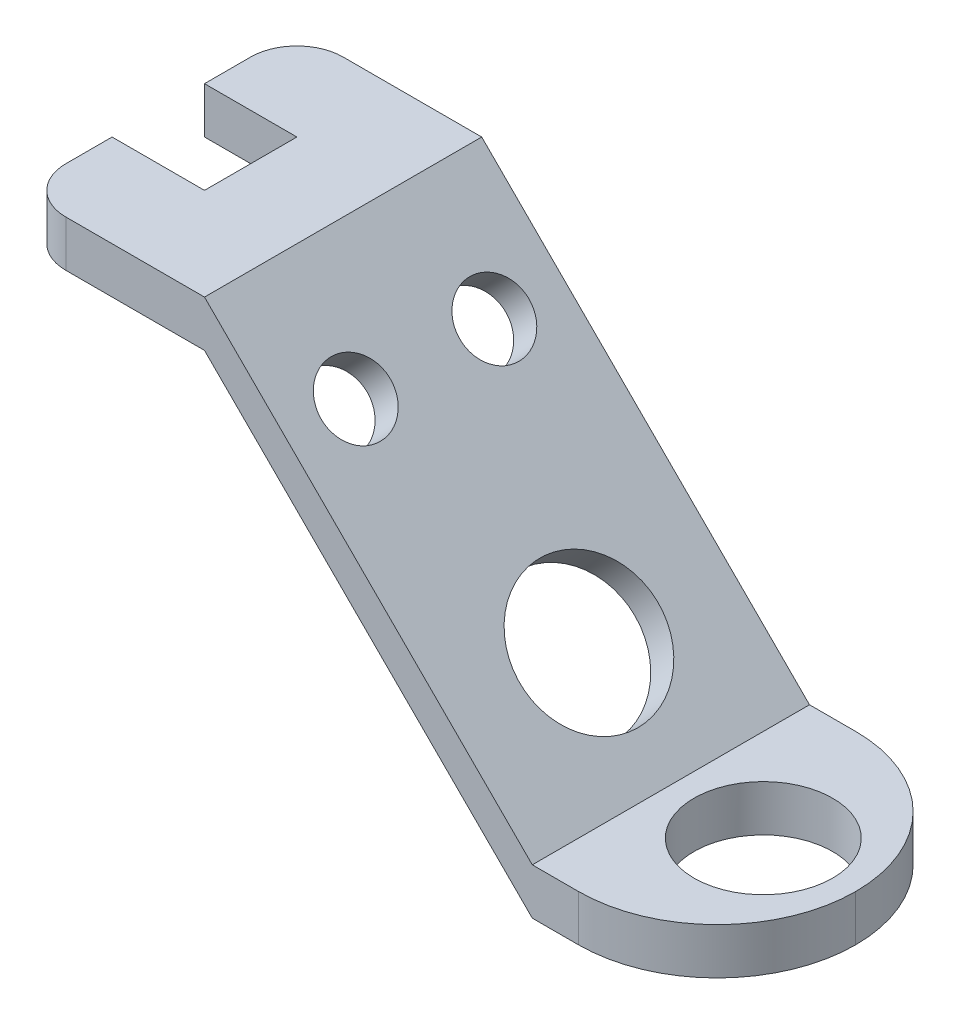
ISO-10303-21;
HEADER;
FILE_DESCRIPTION(('STEP AP214'),'2;1');
FILE_NAME('part.step','',(''),(''),'','','');
FILE_SCHEMA(('AUTOMOTIVE_DESIGN { 1 0 10303 214 1 1 1 1 }'));
ENDSEC;
DATA;
#1=APPLICATION_CONTEXT('core data for automotive mechanical design processes');
#2=APPLICATION_PROTOCOL_DEFINITION('international standard','automotive_design',2000,#1);
#3=PRODUCT_CONTEXT('',#1,'mechanical');
#4=PRODUCT('Part','Part','',(#3));
#5=PRODUCT_RELATED_PRODUCT_CATEGORY('part','',(#4));
#6=PRODUCT_DEFINITION_FORMATION('','',#4);
#7=PRODUCT_DEFINITION_CONTEXT('part definition',#1,'design');
#8=PRODUCT_DEFINITION('design','',#6,#7);
#9=PRODUCT_DEFINITION_SHAPE('','',#8);
#10=(LENGTH_UNIT() NAMED_UNIT(*) SI_UNIT(.MILLI.,.METRE.));
#11=(NAMED_UNIT(*) PLANE_ANGLE_UNIT() SI_UNIT($,.RADIAN.));
#12=(NAMED_UNIT(*) SI_UNIT($,.STERADIAN.) SOLID_ANGLE_UNIT());
#13=UNCERTAINTY_MEASURE_WITH_UNIT(LENGTH_MEASURE(1.E-05),#10,'distance_accuracy_value','');
#14=(GEOMETRIC_REPRESENTATION_CONTEXT(3) GLOBAL_UNCERTAINTY_ASSIGNED_CONTEXT((#13)) GLOBAL_UNIT_ASSIGNED_CONTEXT((#10,
#11,#12)) REPRESENTATION_CONTEXT('',''));
#15=CARTESIAN_POINT('',(0.,0.,0.));
#16=DIRECTION('',(0.,0.,1.));
#17=DIRECTION('',(1.,0.,0.));
#18=AXIS2_PLACEMENT_3D('',#15,#16,#17);
#19=CARTESIAN_POINT('',(-36.1801317233809,22.9071428571429,60.));
#20=DIRECTION('',(1.,0.,0.));
#21=DIRECTION('',(0.,0.,-1.));
#22=AXIS2_PLACEMENT_3D('',#19,#20,#21);
#23=PLANE('',#22);
#24=DIRECTION('',(0.,0.,-1.));
#25=VECTOR('',#24,1.);
#26=CARTESIAN_POINT('',(-36.1801317233809,32.9071428571429,60.));
#27=LINE('',#26,#25);
#28=CARTESIAN_POINT('',(-36.1801317233809,32.9071428571429,20.));
#29=VERTEX_POINT('',#28);
#30=CARTESIAN_POINT('',(-36.1801317233809,32.9071428571429,10.));
#31=VERTEX_POINT('',#30);
#32=EDGE_CURVE('E273',#29,#31,#27,.T.);
#33=ORIENTED_EDGE('',*,*,#32,.T.);
#34=DIRECTION('',(0.,-1.,0.));
#35=VECTOR('',#34,1.);
#36=CARTESIAN_POINT('',(-36.1801317233809,22.9071428571429,10.));
#37=LINE('',#36,#35);
#38=CARTESIAN_POINT('',(-36.1801317233809,22.9071428571429,10.));
#39=VERTEX_POINT('',#38);
#40=EDGE_CURVE('E172',#31,#39,#37,.T.);
#41=ORIENTED_EDGE('',*,*,#40,.T.);
#42=DIRECTION('',(0.,0.,-1.));
#43=VECTOR('',#42,1.);
#44=CARTESIAN_POINT('',(-36.1801317233809,22.9071428571429,60.));
#45=LINE('',#44,#43);
#46=CARTESIAN_POINT('',(-36.1801317233809,22.9071428571429,20.));
#47=VERTEX_POINT('',#46);
#48=EDGE_CURVE('E299',#47,#39,#45,.T.);
#49=ORIENTED_EDGE('',*,*,#48,.F.);
#50=DIRECTION('',(0.,-1.,0.));
#51=VECTOR('',#50,1.);
#52=CARTESIAN_POINT('',(-36.1801317233809,22.9071428571429,20.));
#53=LINE('',#52,#51);
#54=EDGE_CURVE('E280',#29,#47,#53,.T.);
#55=ORIENTED_EDGE('',*,*,#54,.F.);
#56=EDGE_LOOP('',(#33,#41,#49,#55));
#57=FACE_BOUND('',#56,.T.);
#58=ADVANCED_FACE('F34',(#57),#23,.F.);
#59=CARTESIAN_POINT('',(-36.1801317233809,22.9071428571429,50.));
#60=VERTEX_POINT('',#59);
#61=CARTESIAN_POINT('',(-36.1801317233809,22.9071428571429,40.));
#62=VERTEX_POINT('',#61);
#63=EDGE_CURVE('E155',#60,#62,#45,.T.);
#64=ORIENTED_EDGE('',*,*,#63,.F.);
#65=DIRECTION('',(0.,-1.,0.));
#66=VECTOR('',#65,1.);
#67=CARTESIAN_POINT('',(-36.1801317233809,22.9071428571429,50.));
#68=LINE('',#67,#66);
#69=CARTESIAN_POINT('',(-36.1801317233809,32.9071428571429,50.));
#70=VERTEX_POINT('',#69);
#71=EDGE_CURVE('E206',#60,#70,#68,.F.);
#72=ORIENTED_EDGE('',*,*,#71,.T.);
#73=CARTESIAN_POINT('',(-36.1801317233809,32.9071428571429,40.));
#74=VERTEX_POINT('',#73);
#75=EDGE_CURVE('E281',#70,#74,#27,.T.);
#76=ORIENTED_EDGE('',*,*,#75,.T.);
#77=DIRECTION('',(0.,1.,0.));
#78=VECTOR('',#77,1.);
#79=CARTESIAN_POINT('',(-36.1801317233809,22.9071428571429,40.));
#80=LINE('',#79,#78);
#81=EDGE_CURVE('E150',#62,#74,#80,.T.);
#82=ORIENTED_EDGE('',*,*,#81,.F.);
#83=EDGE_LOOP('',(#64,#72,#76,#82));
#84=FACE_BOUND('',#83,.T.);
#85=ADVANCED_FACE('F249',(#84),#23,.F.);
#86=CARTESIAN_POINT('',(-36.1801317233809,22.9071428571429,60.));
#87=DIRECTION('',(0.,1.,0.));
#88=DIRECTION('',(0.,0.,1.));
#89=AXIS2_PLACEMENT_3D('',#86,#87,#88);
#90=PLANE('',#89);
#91=ORIENTED_EDGE('',*,*,#48,.T.);
#92=CARTESIAN_POINT('',(-26.1801317233809,22.9071428571429,10.));
#93=DIRECTION('',(0.,1.,0.));
#94=DIRECTION('',(0.,0.,1.));
#95=AXIS2_PLACEMENT_3D('',#92,#93,#94);
#96=CIRCLE('',#95,10.);
#97=CARTESIAN_POINT('',(-26.1801317233809,22.9071428571429,0.));
#98=VERTEX_POINT('',#97);
#99=EDGE_CURVE('E195',#39,#98,#96,.F.);
#100=ORIENTED_EDGE('',*,*,#99,.T.);
#101=DIRECTION('',(1.,0.,0.));
#102=VECTOR('',#101,1.);
#103=CARTESIAN_POINT('',(-36.1801317233809,22.9071428571429,0.));
#104=LINE('',#103,#102);
#105=CARTESIAN_POINT('',(3.81986827661912,22.9071428571429,0.));
#106=VERTEX_POINT('',#105);
#107=EDGE_CURVE('E307',#98,#106,#104,.T.);
#108=ORIENTED_EDGE('',*,*,#107,.T.);
#109=DIRECTION('',(0.,0.,-1.));
#110=VECTOR('',#109,1.);
#111=CARTESIAN_POINT('',(3.81986827661912,22.9071428571429,60.));
#112=LINE('',#111,#110);
#113=CARTESIAN_POINT('',(3.81986827661912,22.9071428571429,60.));
#114=VERTEX_POINT('',#113);
#115=EDGE_CURVE('E297',#114,#106,#112,.T.);
#116=ORIENTED_EDGE('',*,*,#115,.F.);
#117=DIRECTION('',(1.,0.,0.));
#118=VECTOR('',#117,1.);
#119=CARTESIAN_POINT('',(-36.1801317233809,22.9071428571429,60.));
#120=LINE('',#119,#118);
#121=CARTESIAN_POINT('',(-26.1801317233809,22.9071428571429,60.));
#122=VERTEX_POINT('',#121);
#123=EDGE_CURVE('E313',#122,#114,#120,.T.);
#124=ORIENTED_EDGE('',*,*,#123,.F.);
#125=CARTESIAN_POINT('',(-26.1801317233809,22.9071428571429,50.));
#126=DIRECTION('',(0.,1.,0.));
#127=DIRECTION('',(0.,0.,1.));
#128=AXIS2_PLACEMENT_3D('',#125,#126,#127);
#129=CIRCLE('',#128,10.);
#130=EDGE_CURVE('E193',#122,#60,#129,.F.);
#131=ORIENTED_EDGE('',*,*,#130,.T.);
#132=ORIENTED_EDGE('',*,*,#63,.T.);
#133=DIRECTION('',(-1.,0.,0.));
#134=VECTOR('',#133,1.);
#135=CARTESIAN_POINT('',(-36.1801317233809,22.9071428571429,40.));
#136=LINE('',#135,#134);
#137=CARTESIAN_POINT('',(-16.1801317233809,22.9071428571429,40.));
#138=VERTEX_POINT('',#137);
#139=EDGE_CURVE('E309',#138,#62,#136,.T.);
#140=ORIENTED_EDGE('',*,*,#139,.F.);
#141=DIRECTION('',(0.,0.,1.));
#142=VECTOR('',#141,1.);
#143=CARTESIAN_POINT('',(-16.1801317233809,22.9071428571429,60.));
#144=LINE('',#143,#142);
#145=CARTESIAN_POINT('',(-16.1801317233809,22.9071428571429,20.));
#146=VERTEX_POINT('',#145);
#147=EDGE_CURVE('E162',#146,#138,#144,.T.);
#148=ORIENTED_EDGE('',*,*,#147,.F.);
#149=DIRECTION('',(1.,0.,0.));
#150=VECTOR('',#149,1.);
#151=CARTESIAN_POINT('',(-36.1801317233809,22.9071428571429,20.));
#152=LINE('',#151,#150);
#153=EDGE_CURVE('E304',#47,#146,#152,.T.);
#154=ORIENTED_EDGE('',*,*,#153,.F.);
#155=EDGE_LOOP('',(#91,#100,#108,#116,#124,#131,#132,#140,#148,#154));
#156=FACE_BOUND('',#155,.T.);
#157=ADVANCED_FACE('F255',(#156),#90,.F.);
#158=CARTESIAN_POINT('',(-36.1801317233809,32.9071428571429,60.));
#159=DIRECTION('',(0.,-1.,0.));
#160=DIRECTION('',(0.,0.,-1.));
#161=AXIS2_PLACEMENT_3D('',#158,#159,#160);
#162=PLANE('',#161);
#163=DIRECTION('',(-1.,0.,0.));
#164=VECTOR('',#163,1.);
#165=CARTESIAN_POINT('',(-36.1801317233809,32.9071428571429,0.));
#166=LINE('',#165,#164);
#167=CARTESIAN_POINT('',(3.81986827661912,32.9071428571429,0.));
#168=VERTEX_POINT('',#167);
#169=CARTESIAN_POINT('',(-26.1801317233809,32.9071428571429,0.));
#170=VERTEX_POINT('',#169);
#171=EDGE_CURVE('E276',#168,#170,#166,.T.);
#172=ORIENTED_EDGE('',*,*,#171,.T.);
#173=CARTESIAN_POINT('',(-26.1801317233809,32.9071428571429,10.));
#174=DIRECTION('',(0.,-1.,0.));
#175=DIRECTION('',(0.,0.,-1.));
#176=AXIS2_PLACEMENT_3D('',#173,#174,#175);
#177=CIRCLE('',#176,10.);
#178=EDGE_CURVE('E201',#170,#31,#177,.F.);
#179=ORIENTED_EDGE('',*,*,#178,.T.);
#180=ORIENTED_EDGE('',*,*,#32,.F.);
#181=DIRECTION('',(-1.,0.,0.));
#182=VECTOR('',#181,1.);
#183=CARTESIAN_POINT('',(-36.1801317233809,32.9071428571429,20.));
#184=LINE('',#183,#182);
#185=CARTESIAN_POINT('',(-16.1801317233809,32.9071428571429,20.));
#186=VERTEX_POINT('',#185);
#187=EDGE_CURVE('E170',#186,#29,#184,.T.);
#188=ORIENTED_EDGE('',*,*,#187,.F.);
#189=DIRECTION('',(0.,0.,-1.));
#190=VECTOR('',#189,1.);
#191=CARTESIAN_POINT('',(-16.1801317233809,32.9071428571429,60.));
#192=LINE('',#191,#190);
#193=CARTESIAN_POINT('',(-16.1801317233809,32.9071428571429,40.));
#194=VERTEX_POINT('',#193);
#195=EDGE_CURVE('E154',#194,#186,#192,.T.);
#196=ORIENTED_EDGE('',*,*,#195,.F.);
#197=DIRECTION('',(1.,0.,0.));
#198=VECTOR('',#197,1.);
#199=CARTESIAN_POINT('',(-36.1801317233809,32.9071428571429,40.));
#200=LINE('',#199,#198);
#201=EDGE_CURVE('E143',#74,#194,#200,.T.);
#202=ORIENTED_EDGE('',*,*,#201,.F.);
#203=ORIENTED_EDGE('',*,*,#75,.F.);
#204=CARTESIAN_POINT('',(-26.1801317233809,32.9071428571429,50.));
#205=DIRECTION('',(0.,-1.,0.));
#206=DIRECTION('',(0.,0.,-1.));
#207=AXIS2_PLACEMENT_3D('',#204,#205,#206);
#208=CIRCLE('',#207,10.);
#209=CARTESIAN_POINT('',(-26.1801317233809,32.9071428571429,60.));
#210=VERTEX_POINT('',#209);
#211=EDGE_CURVE('E199',#70,#210,#208,.F.);
#212=ORIENTED_EDGE('',*,*,#211,.T.);
#213=DIRECTION('',(-1.,0.,0.));
#214=VECTOR('',#213,1.);
#215=CARTESIAN_POINT('',(-36.1801317233809,32.9071428571429,60.));
#216=LINE('',#215,#214);
#217=CARTESIAN_POINT('',(3.81986827661912,32.9071428571429,60.));
#218=VERTEX_POINT('',#217);
#219=EDGE_CURVE('E282',#218,#210,#216,.T.);
#220=ORIENTED_EDGE('',*,*,#219,.F.);
#221=DIRECTION('',(0.,0.,-1.));
#222=VECTOR('',#221,1.);
#223=CARTESIAN_POINT('',(3.81986827661912,32.9071428571429,60.));
#224=LINE('',#223,#222);
#225=EDGE_CURVE('E284',#218,#168,#224,.T.);
#226=ORIENTED_EDGE('',*,*,#225,.T.);
#227=EDGE_LOOP('',(#172,#179,#180,#188,#196,#202,#203,#212,#220,#226));
#228=FACE_BOUND('',#227,.T.);
#229=ADVANCED_FACE('F168',(#228),#162,.F.);
#230=CARTESIAN_POINT('',(3.81986827661912,22.9071428571429,60.));
#231=DIRECTION('',(0.707106781186549,0.707106781186546,0.));
#232=DIRECTION('',(-0.707106781186546,0.707106781186549,0.));
#233=AXIS2_PLACEMENT_3D('',#230,#231,#232);
#234=PLANE('',#233);
#235=CARTESIAN_POINT('',(16.5568586944333,10.1701524393287,45.));
#236=DIRECTION('',(0.707106781186549,0.707106781186546,0.));
#237=DIRECTION('',(-0.707106781186546,0.707106781186549,0.));
#238=AXIS2_PLACEMENT_3D('',#235,#236,#237);
#239=CIRCLE('',#238,7.5);
#240=CARTESIAN_POINT('',(11.2535578355342,15.4734532982278,45.));
#241=VERTEX_POINT('',#240);
#242=EDGE_CURVE('E179',#241,#241,#239,.F.);
#243=ORIENTED_EDGE('',*,*,#242,.F.);
#244=EDGE_LOOP('',(#243));
#245=FACE_BOUND('',#244,.T.);
#246=CARTESIAN_POINT('',(52.0308395300616,-25.3038283962998,30.));
#247=DIRECTION('',(0.707106781186549,0.707106781186546,0.));
#248=DIRECTION('',(-0.707106781186546,0.707106781186549,0.));
#249=AXIS2_PLACEMENT_3D('',#246,#247,#248);
#250=CIRCLE('',#249,15.);
#251=CARTESIAN_POINT('',(41.4242378122634,-14.6972266785016,30.));
#252=VERTEX_POINT('',#251);
#253=EDGE_CURVE('E187',#252,#252,#250,.F.);
#254=ORIENTED_EDGE('',*,*,#253,.F.);
#255=EDGE_LOOP('',(#254));
#256=FACE_BOUND('',#255,.T.);
#257=CARTESIAN_POINT('',(16.5568586944333,10.1701524393287,15.));
#258=DIRECTION('',(0.707106781186549,0.707106781186546,0.));
#259=DIRECTION('',(-0.707106781186546,0.707106781186549,0.));
#260=AXIS2_PLACEMENT_3D('',#257,#258,#259);
#261=CIRCLE('',#260,7.5);
#262=CARTESIAN_POINT('',(11.2535578355342,15.4734532982278,15.));
#263=VERTEX_POINT('',#262);
#264=EDGE_CURVE('E183',#263,#263,#261,.F.);
#265=ORIENTED_EDGE('',*,*,#264,.F.);
#266=EDGE_LOOP('',(#265));
#267=FACE_BOUND('',#266,.T.);
#268=DIRECTION('',(0.707106781186546,-0.707106781186549,0.));
#269=VECTOR('',#268,1.);
#270=CARTESIAN_POINT('',(3.81986827661912,22.9071428571429,0.));
#271=LINE('',#270,#269);
#272=CARTESIAN_POINT('',(74.7678299478758,-48.0408188141141,0.));
#273=VERTEX_POINT('',#272);
#274=EDGE_CURVE('E319',#106,#273,#271,.T.);
#275=ORIENTED_EDGE('',*,*,#274,.T.);
#276=DIRECTION('',(0.,0.,-1.));
#277=VECTOR('',#276,1.);
#278=CARTESIAN_POINT('',(74.7678299478758,-48.0408188141141,60.));
#279=LINE('',#278,#277);
#280=CARTESIAN_POINT('',(74.7678299478758,-48.0408188141141,60.));
#281=VERTEX_POINT('',#280);
#282=EDGE_CURVE('E295',#281,#273,#279,.T.);
#283=ORIENTED_EDGE('',*,*,#282,.F.);
#284=DIRECTION('',(0.707106781186546,-0.707106781186549,0.));
#285=VECTOR('',#284,1.);
#286=CARTESIAN_POINT('',(3.81986827661912,22.9071428571429,60.));
#287=LINE('',#286,#285);
#288=EDGE_CURVE('E229',#114,#281,#287,.T.);
#289=ORIENTED_EDGE('',*,*,#288,.F.);
#290=ORIENTED_EDGE('',*,*,#115,.T.);
#291=EDGE_LOOP('',(#275,#283,#289,#290));
#292=FACE_BOUND('',#291,.T.);
#293=ADVANCED_FACE('F336',(#245,#256,#267,#292),#234,.F.);
#294=CARTESIAN_POINT('',(114.767829947876,-48.0408188141141,60.));
#295=DIRECTION('',(0.,1.,0.));
#296=DIRECTION('',(0.,0.,1.));
#297=AXIS2_PLACEMENT_3D('',#294,#295,#296);
#298=PLANE('',#297);
#299=CARTESIAN_POINT('',(94.7678299478758,-48.0408188141141,30.));
#300=DIRECTION('',(0.,1.,0.));
#301=DIRECTION('',(0.,0.,1.));
#302=AXIS2_PLACEMENT_3D('',#299,#300,#301);
#303=CIRCLE('',#302,15.);
#304=CARTESIAN_POINT('',(94.7678299478758,-48.0408188141141,45.));
#305=VERTEX_POINT('',#304);
#306=EDGE_CURVE('E164',#305,#305,#303,.T.);
#307=ORIENTED_EDGE('',*,*,#306,.T.);
#308=EDGE_LOOP('',(#307));
#309=FACE_BOUND('',#308,.T.);
#310=CARTESIAN_POINT('',(84.7678299478758,-48.0408188141141,30.));
#311=DIRECTION('',(0.,1.,0.));
#312=DIRECTION('',(0.,0.,1.));
#313=AXIS2_PLACEMENT_3D('',#310,#311,#312);
#314=CIRCLE('',#313,30.);
#315=CARTESIAN_POINT('',(84.7678299478758,-48.0408188141141,0.));
#316=VERTEX_POINT('',#315);
#317=CARTESIAN_POINT('',(114.767829947876,-48.0408188141141,30.));
#318=VERTEX_POINT('',#317);
#319=EDGE_CURVE('E50',#316,#318,#314,.F.);
#320=ORIENTED_EDGE('',*,*,#319,.T.);
#321=CARTESIAN_POINT('',(84.7678299478758,-48.0408188141141,30.));
#322=DIRECTION('',(0.,1.,0.));
#323=DIRECTION('',(0.,0.,1.));
#324=AXIS2_PLACEMENT_3D('',#321,#322,#323);
#325=CIRCLE('',#324,30.);
#326=CARTESIAN_POINT('',(84.7678299478758,-48.0408188141141,60.));
#327=VERTEX_POINT('',#326);
#328=EDGE_CURVE('E43',#318,#327,#325,.F.);
#329=ORIENTED_EDGE('',*,*,#328,.T.);
#330=DIRECTION('',(1.,0.,0.));
#331=VECTOR('',#330,1.);
#332=CARTESIAN_POINT('',(114.767829947876,-48.0408188141141,60.));
#333=LINE('',#332,#331);
#334=EDGE_CURVE('E221',#281,#327,#333,.T.);
#335=ORIENTED_EDGE('',*,*,#334,.F.);
#336=ORIENTED_EDGE('',*,*,#282,.T.);
#337=DIRECTION('',(1.,0.,0.));
#338=VECTOR('',#337,1.);
#339=CARTESIAN_POINT('',(114.767829947876,-48.0408188141141,0.));
#340=LINE('',#339,#338);
#341=EDGE_CURVE('E321',#273,#316,#340,.T.);
#342=ORIENTED_EDGE('',*,*,#341,.T.);
#343=EDGE_LOOP('',(#320,#329,#335,#336,#342));
#344=FACE_BOUND('',#343,.T.);
#345=ADVANCED_FACE('F219',(#309,#344),#298,.F.);
#346=CARTESIAN_POINT('',(74.7678299478758,-38.040818814114,60.));
#347=DIRECTION('',(0.,-1.,0.));
#348=DIRECTION('',(1.,0.,0.));
#349=AXIS2_PLACEMENT_3D('',#346,#347,#348);
#350=PLANE('',#349);
#351=CARTESIAN_POINT('',(94.7678299478758,-38.040818814114,30.));
#352=DIRECTION('',(0.,-1.,0.));
#353=DIRECTION('',(1.,0.,0.));
#354=AXIS2_PLACEMENT_3D('',#351,#352,#353);
#355=CIRCLE('',#354,15.);
#356=CARTESIAN_POINT('',(109.767829947876,-38.040818814114,30.));
#357=VERTEX_POINT('',#356);
#358=EDGE_CURVE('E176',#357,#357,#355,.T.);
#359=ORIENTED_EDGE('',*,*,#358,.T.);
#360=EDGE_LOOP('',(#359));
#361=FACE_BOUND('',#360,.T.);
#362=DIRECTION('',(-1.,0.,0.));
#363=VECTOR('',#362,1.);
#364=CARTESIAN_POINT('',(74.7678299478758,-38.040818814114,60.));
#365=LINE('',#364,#363);
#366=CARTESIAN_POINT('',(84.7678299478758,-38.040818814114,60.));
#367=VERTEX_POINT('',#366);
#368=CARTESIAN_POINT('',(74.7678299478758,-38.040818814114,60.));
#369=VERTEX_POINT('',#368);
#370=EDGE_CURVE('E231',#367,#369,#365,.T.);
#371=ORIENTED_EDGE('',*,*,#370,.F.);
#372=CARTESIAN_POINT('',(84.7678299478758,-38.040818814114,30.));
#373=DIRECTION('',(0.,-1.,0.));
#374=DIRECTION('',(1.,0.,0.));
#375=AXIS2_PLACEMENT_3D('',#372,#373,#374);
#376=CIRCLE('',#375,30.);
#377=CARTESIAN_POINT('',(114.767829947876,-38.0408188141141,30.));
#378=VERTEX_POINT('',#377);
#379=EDGE_CURVE('E213',#367,#378,#376,.F.);
#380=ORIENTED_EDGE('',*,*,#379,.T.);
#381=CARTESIAN_POINT('',(84.7678299478758,-38.040818814114,30.));
#382=DIRECTION('',(0.,-1.,0.));
#383=DIRECTION('',(1.,0.,0.));
#384=AXIS2_PLACEMENT_3D('',#381,#382,#383);
#385=CIRCLE('',#384,30.);
#386=CARTESIAN_POINT('',(84.7678299478758,-38.040818814114,0.));
#387=VERTEX_POINT('',#386);
#388=EDGE_CURVE('E211',#378,#387,#385,.F.);
#389=ORIENTED_EDGE('',*,*,#388,.T.);
#390=DIRECTION('',(-1.,0.,0.));
#391=VECTOR('',#390,1.);
#392=CARTESIAN_POINT('',(74.7678299478758,-38.040818814114,0.));
#393=LINE('',#392,#391);
#394=CARTESIAN_POINT('',(74.7678299478758,-38.040818814114,0.));
#395=VERTEX_POINT('',#394);
#396=EDGE_CURVE('E323',#387,#395,#393,.T.);
#397=ORIENTED_EDGE('',*,*,#396,.T.);
#398=DIRECTION('',(0.,0.,-1.));
#399=VECTOR('',#398,1.);
#400=CARTESIAN_POINT('',(74.7678299478758,-38.040818814114,60.));
#401=LINE('',#400,#399);
#402=EDGE_CURVE('E292',#369,#395,#401,.T.);
#403=ORIENTED_EDGE('',*,*,#402,.F.);
#404=EDGE_LOOP('',(#371,#380,#389,#397,#403));
#405=FACE_BOUND('',#404,.T.);
#406=ADVANCED_FACE('F236',(#361,#405),#350,.F.);
#407=CARTESIAN_POINT('',(3.81986827661912,32.9071428571429,60.));
#408=DIRECTION('',(-0.707106781186549,-0.707106781186546,0.));
#409=DIRECTION('',(0.707106781186546,-0.707106781186549,0.));
#410=AXIS2_PLACEMENT_3D('',#407,#408,#409);
#411=PLANE('',#410);
#412=CARTESIAN_POINT('',(21.5568586944333,15.1701524393286,45.));
#413=DIRECTION('',(-0.707106781186549,-0.707106781186546,0.));
#414=DIRECTION('',(0.707106781186546,-0.707106781186549,0.));
#415=AXIS2_PLACEMENT_3D('',#412,#413,#414);
#416=CIRCLE('',#415,7.5);
#417=CARTESIAN_POINT('',(26.8601595533324,9.86685158042953,45.));
#418=VERTEX_POINT('',#417);
#419=EDGE_CURVE('E188',#418,#418,#416,.F.);
#420=ORIENTED_EDGE('',*,*,#419,.F.);
#421=EDGE_LOOP('',(#420));
#422=FACE_BOUND('',#421,.T.);
#423=CARTESIAN_POINT('',(57.0308395300616,-20.3038283962998,30.));
#424=DIRECTION('',(-0.707106781186549,-0.707106781186546,0.));
#425=DIRECTION('',(0.707106781186546,-0.707106781186549,0.));
#426=AXIS2_PLACEMENT_3D('',#423,#424,#425);
#427=CIRCLE('',#426,15.);
#428=CARTESIAN_POINT('',(67.6374412478598,-30.910430114098,30.));
#429=VERTEX_POINT('',#428);
#430=EDGE_CURVE('E184',#429,#429,#427,.F.);
#431=ORIENTED_EDGE('',*,*,#430,.F.);
#432=EDGE_LOOP('',(#431));
#433=FACE_BOUND('',#432,.T.);
#434=CARTESIAN_POINT('',(21.5568586944333,15.1701524393286,15.));
#435=DIRECTION('',(-0.707106781186549,-0.707106781186546,0.));
#436=DIRECTION('',(0.707106781186546,-0.707106781186549,0.));
#437=AXIS2_PLACEMENT_3D('',#434,#435,#436);
#438=CIRCLE('',#437,7.5);
#439=CARTESIAN_POINT('',(26.8601595533324,9.86685158042953,15.));
#440=VERTEX_POINT('',#439);
#441=EDGE_CURVE('E180',#440,#440,#438,.F.);
#442=ORIENTED_EDGE('',*,*,#441,.F.);
#443=EDGE_LOOP('',(#442));
#444=FACE_BOUND('',#443,.T.);
#445=DIRECTION('',(-0.707106781186546,0.707106781186549,0.));
#446=VECTOR('',#445,1.);
#447=CARTESIAN_POINT('',(3.81986827661912,32.9071428571429,0.));
#448=LINE('',#447,#446);
#449=EDGE_CURVE('E324',#395,#168,#448,.T.);
#450=ORIENTED_EDGE('',*,*,#449,.T.);
#451=ORIENTED_EDGE('',*,*,#225,.F.);
#452=DIRECTION('',(-0.707106781186546,0.707106781186549,0.));
#453=VECTOR('',#452,1.);
#454=CARTESIAN_POINT('',(3.81986827661912,32.9071428571429,60.));
#455=LINE('',#454,#453);
#456=EDGE_CURVE('E286',#369,#218,#455,.T.);
#457=ORIENTED_EDGE('',*,*,#456,.F.);
#458=ORIENTED_EDGE('',*,*,#402,.T.);
#459=EDGE_LOOP('',(#450,#451,#457,#458));
#460=FACE_BOUND('',#459,.T.);
#461=ADVANCED_FACE('F328',(#422,#433,#444,#460),#411,.F.);
#462=CARTESIAN_POINT('',(0.,0.,60.));
#463=DIRECTION('',(0.,0.,-1.));
#464=DIRECTION('',(-1.,0.,0.));
#465=AXIS2_PLACEMENT_3D('',#462,#463,#464);
#466=PLANE('',#465);
#467=ORIENTED_EDGE('',*,*,#334,.T.);
#468=DIRECTION('',(0.,1.,0.));
#469=VECTOR('',#468,1.);
#470=CARTESIAN_POINT('',(84.7678299478758,0.,60.));
#471=LINE('',#470,#469);
#472=EDGE_CURVE('E208',#327,#367,#471,.T.);
#473=ORIENTED_EDGE('',*,*,#472,.T.);
#474=ORIENTED_EDGE('',*,*,#370,.T.);
#475=ORIENTED_EDGE('',*,*,#456,.T.);
#476=ORIENTED_EDGE('',*,*,#219,.T.);
#477=DIRECTION('',(0.,-1.,0.));
#478=VECTOR('',#477,1.);
#479=CARTESIAN_POINT('',(-26.1801317233809,0.,60.));
#480=LINE('',#479,#478);
#481=EDGE_CURVE('E203',#210,#122,#480,.T.);
#482=ORIENTED_EDGE('',*,*,#481,.T.);
#483=ORIENTED_EDGE('',*,*,#123,.T.);
#484=ORIENTED_EDGE('',*,*,#288,.T.);
#485=EDGE_LOOP('',(#467,#473,#474,#475,#476,#482,#483,#484));
#486=FACE_BOUND('',#485,.T.);
#487=ADVANCED_FACE('F226',(#486),#466,.F.);
#488=CARTESIAN_POINT('',(0.,0.,0.));
#489=DIRECTION('',(0.,0.,-1.));
#490=DIRECTION('',(-1.,0.,0.));
#491=AXIS2_PLACEMENT_3D('',#488,#489,#490);
#492=PLANE('',#491);
#493=ORIENTED_EDGE('',*,*,#396,.F.);
#494=DIRECTION('',(0.,1.,0.));
#495=VECTOR('',#494,1.);
#496=CARTESIAN_POINT('',(84.7678299478758,-48.0408188141141,0.));
#497=LINE('',#496,#495);
#498=EDGE_CURVE('E11',#387,#316,#497,.F.);
#499=ORIENTED_EDGE('',*,*,#498,.T.);
#500=ORIENTED_EDGE('',*,*,#341,.F.);
#501=ORIENTED_EDGE('',*,*,#274,.F.);
#502=ORIENTED_EDGE('',*,*,#107,.F.);
#503=DIRECTION('',(0.,-1.,0.));
#504=VECTOR('',#503,1.);
#505=CARTESIAN_POINT('',(-26.1801317233809,32.9071428571429,0.));
#506=LINE('',#505,#504);
#507=EDGE_CURVE('E197',#98,#170,#506,.F.);
#508=ORIENTED_EDGE('',*,*,#507,.T.);
#509=ORIENTED_EDGE('',*,*,#171,.F.);
#510=ORIENTED_EDGE('',*,*,#449,.F.);
#511=EDGE_LOOP('',(#493,#499,#500,#501,#502,#508,#509,#510));
#512=FACE_BOUND('',#511,.T.);
#513=ADVANCED_FACE('F331',(#512),#492,.T.);
#514=CARTESIAN_POINT('',(-16.1801317233809,46.,40.));
#515=DIRECTION('',(-1.,0.,0.));
#516=DIRECTION('',(0.,0.,1.));
#517=AXIS2_PLACEMENT_3D('',#514,#515,#516);
#518=PLANE('',#517);
#519=ORIENTED_EDGE('',*,*,#147,.T.);
#520=DIRECTION('',(0.,-1.,0.));
#521=VECTOR('',#520,1.);
#522=CARTESIAN_POINT('',(-16.1801317233809,46.,40.));
#523=LINE('',#522,#521);
#524=EDGE_CURVE('E147',#194,#138,#523,.T.);
#525=ORIENTED_EDGE('',*,*,#524,.F.);
#526=ORIENTED_EDGE('',*,*,#195,.T.);
#527=DIRECTION('',(0.,-1.,0.));
#528=VECTOR('',#527,1.);
#529=CARTESIAN_POINT('',(-16.1801317233809,46.,20.));
#530=LINE('',#529,#528);
#531=EDGE_CURVE('E163',#186,#146,#530,.T.);
#532=ORIENTED_EDGE('',*,*,#531,.T.);
#533=EDGE_LOOP('',(#519,#525,#526,#532));
#534=FACE_BOUND('',#533,.T.);
#535=ADVANCED_FACE('F158',(#534),#518,.T.);
#536=CARTESIAN_POINT('',(-56.1801317233809,46.,20.));
#537=DIRECTION('',(0.,0.,1.));
#538=DIRECTION('',(1.,0.,0.));
#539=AXIS2_PLACEMENT_3D('',#536,#537,#538);
#540=PLANE('',#539);
#541=ORIENTED_EDGE('',*,*,#153,.T.);
#542=ORIENTED_EDGE('',*,*,#531,.F.);
#543=ORIENTED_EDGE('',*,*,#187,.T.);
#544=ORIENTED_EDGE('',*,*,#54,.T.);
#545=EDGE_LOOP('',(#541,#542,#543,#544));
#546=FACE_BOUND('',#545,.T.);
#547=ADVANCED_FACE('F361',(#546),#540,.T.);
#548=CARTESIAN_POINT('',(-56.1801317233809,46.,40.));
#549=DIRECTION('',(0.,0.,-1.));
#550=DIRECTION('',(-1.,0.,0.));
#551=AXIS2_PLACEMENT_3D('',#548,#549,#550);
#552=PLANE('',#551);
#553=ORIENTED_EDGE('',*,*,#139,.T.);
#554=ORIENTED_EDGE('',*,*,#81,.T.);
#555=ORIENTED_EDGE('',*,*,#201,.T.);
#556=ORIENTED_EDGE('',*,*,#524,.T.);
#557=EDGE_LOOP('',(#553,#554,#555,#556));
#558=FACE_BOUND('',#557,.T.);
#559=ADVANCED_FACE('F146',(#558),#552,.T.);
#560=CARTESIAN_POINT('',(94.7678299478758,-57.0000000000001,30.));
#561=DIRECTION('',(0.,1.,0.));
#562=DIRECTION('',(0.,0.,1.));
#563=AXIS2_PLACEMENT_3D('',#560,#561,#562);
#564=CYLINDRICAL_SURFACE('',#563,15.);
#565=ORIENTED_EDGE('',*,*,#358,.F.);
#566=EDGE_LOOP('',(#565));
#567=FACE_BOUND('',#566,.T.);
#568=ORIENTED_EDGE('',*,*,#306,.F.);
#569=EDGE_LOOP('',(#568));
#570=FACE_BOUND('',#569,.T.);
#571=ADVANCED_FACE('F366',(#567,#570),#564,.F.);
#572=CARTESIAN_POINT('',(32.8705671934181,26.4838609383134,15.));
#573=DIRECTION('',(-0.707106781186549,-0.707106781186546,0.));
#574=DIRECTION('',(0.707106781186546,-0.707106781186549,0.));
#575=AXIS2_PLACEMENT_3D('',#572,#573,#574);
#576=CYLINDRICAL_SURFACE('',#575,7.5);
#577=ORIENTED_EDGE('',*,*,#441,.T.);
#578=EDGE_LOOP('',(#577));
#579=FACE_BOUND('',#578,.T.);
#580=ORIENTED_EDGE('',*,*,#264,.T.);
#581=EDGE_LOOP('',(#580));
#582=FACE_BOUND('',#581,.T.);
#583=ADVANCED_FACE('F369',(#579,#582),#576,.F.);
#584=CARTESIAN_POINT('',(68.3445480290464,-8.99011989731505,30.));
#585=DIRECTION('',(-0.707106781186549,-0.707106781186546,0.));
#586=DIRECTION('',(0.707106781186546,-0.707106781186549,0.));
#587=AXIS2_PLACEMENT_3D('',#584,#585,#586);
#588=CYLINDRICAL_SURFACE('',#587,15.);
#589=ORIENTED_EDGE('',*,*,#430,.T.);
#590=EDGE_LOOP('',(#589));
#591=FACE_BOUND('',#590,.T.);
#592=ORIENTED_EDGE('',*,*,#253,.T.);
#593=EDGE_LOOP('',(#592));
#594=FACE_BOUND('',#593,.T.);
#595=ADVANCED_FACE('F267',(#591,#594),#588,.F.);
#596=CARTESIAN_POINT('',(32.8705671934181,26.4838609383134,45.));
#597=DIRECTION('',(-0.707106781186549,-0.707106781186546,0.));
#598=DIRECTION('',(0.707106781186546,-0.707106781186549,0.));
#599=AXIS2_PLACEMENT_3D('',#596,#597,#598);
#600=CYLINDRICAL_SURFACE('',#599,7.5);
#601=ORIENTED_EDGE('',*,*,#419,.T.);
#602=EDGE_LOOP('',(#601));
#603=FACE_BOUND('',#602,.T.);
#604=ORIENTED_EDGE('',*,*,#242,.T.);
#605=EDGE_LOOP('',(#604));
#606=FACE_BOUND('',#605,.T.);
#607=ADVANCED_FACE('F262',(#603,#606),#600,.F.);
#608=CARTESIAN_POINT('',(-26.1801317233809,22.9071428571429,10.));
#609=DIRECTION('',(0.,1.,0.));
#610=DIRECTION('',(0.,0.,1.));
#611=AXIS2_PLACEMENT_3D('',#608,#609,#610);
#612=CYLINDRICAL_SURFACE('',#611,10.);
#613=ORIENTED_EDGE('',*,*,#178,.F.);
#614=ORIENTED_EDGE('',*,*,#507,.F.);
#615=ORIENTED_EDGE('',*,*,#99,.F.);
#616=ORIENTED_EDGE('',*,*,#40,.F.);
#617=EDGE_LOOP('',(#613,#614,#615,#616));
#618=FACE_BOUND('',#617,.T.);
#619=ADVANCED_FACE('F245',(#618),#612,.T.);
#620=CARTESIAN_POINT('',(-26.1801317233809,0.,50.));
#621=DIRECTION('',(0.,-1.,0.));
#622=DIRECTION('',(0.,0.,-1.));
#623=AXIS2_PLACEMENT_3D('',#620,#621,#622);
#624=CYLINDRICAL_SURFACE('',#623,10.);
#625=ORIENTED_EDGE('',*,*,#211,.F.);
#626=ORIENTED_EDGE('',*,*,#71,.F.);
#627=ORIENTED_EDGE('',*,*,#130,.F.);
#628=ORIENTED_EDGE('',*,*,#481,.F.);
#629=EDGE_LOOP('',(#625,#626,#627,#628));
#630=FACE_BOUND('',#629,.T.);
#631=ADVANCED_FACE('F240',(#630),#624,.T.);
#632=CARTESIAN_POINT('',(84.7678299478758,-38.0408188141141,30.));
#633=DIRECTION('',(0.,-1.,0.));
#634=DIRECTION('',(0.,0.,-1.));
#635=AXIS2_PLACEMENT_3D('',#632,#633,#634);
#636=CYLINDRICAL_SURFACE('',#635,30.);
#637=DIRECTION('',(0.,1.,0.));
#638=VECTOR('',#637,1.);
#639=CARTESIAN_POINT('',(114.767829947876,-38.0408188141141,30.));
#640=LINE('',#639,#638);
#641=EDGE_CURVE('E38',#318,#378,#640,.T.);
#642=ORIENTED_EDGE('',*,*,#641,.F.);
#643=ORIENTED_EDGE('',*,*,#319,.F.);
#644=ORIENTED_EDGE('',*,*,#498,.F.);
#645=ORIENTED_EDGE('',*,*,#388,.F.);
#646=EDGE_LOOP('',(#642,#643,#644,#645));
#647=FACE_BOUND('',#646,.T.);
#648=ADVANCED_FACE('F36',(#647),#636,.T.);
#649=CARTESIAN_POINT('',(84.7678299478758,0.,30.));
#650=DIRECTION('',(0.,1.,0.));
#651=DIRECTION('',(0.,0.,1.));
#652=AXIS2_PLACEMENT_3D('',#649,#650,#651);
#653=CYLINDRICAL_SURFACE('',#652,30.);
#654=ORIENTED_EDGE('',*,*,#328,.F.);
#655=ORIENTED_EDGE('',*,*,#641,.T.);
#656=ORIENTED_EDGE('',*,*,#379,.F.);
#657=ORIENTED_EDGE('',*,*,#472,.F.);
#658=EDGE_LOOP('',(#654,#655,#656,#657));
#659=FACE_BOUND('',#658,.T.);
#660=ADVANCED_FACE('F233',(#659),#653,.T.);
#661=CLOSED_SHELL('',(#58,#85,#157,#229,#293,#345,#406,#461,#487,#513,#535,#547,#559,#571,#583,
#595,#607,#619,#631,#648,#660));
#662=MANIFOLD_SOLID_BREP('B2',#661);
#663=ADVANCED_BREP_SHAPE_REPRESENTATION('',(#18,#662),#14);
#664=SHAPE_DEFINITION_REPRESENTATION(#9,#663);
ENDSEC;
END-ISO-10303-21;
